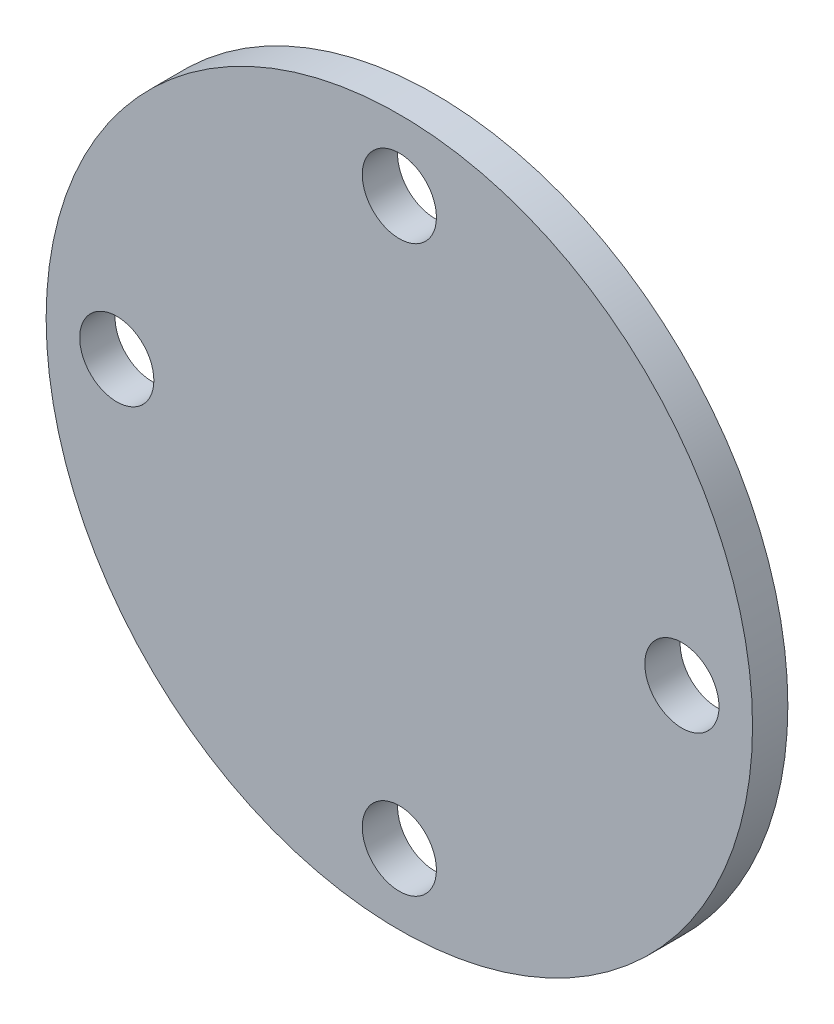
ISO-10303-21;
HEADER;
FILE_DESCRIPTION(('STEP AP214'),'2;1');
FILE_NAME('part.step','',(''),(''),'','','');
FILE_SCHEMA(('AUTOMOTIVE_DESIGN { 1 0 10303 214 1 1 1 1 }'));
ENDSEC;
DATA;
#1=APPLICATION_CONTEXT('core data for automotive mechanical design processes');
#2=APPLICATION_PROTOCOL_DEFINITION('international standard','automotive_design',2000,#1);
#3=PRODUCT_CONTEXT('',#1,'mechanical');
#4=PRODUCT('Part','Part','',(#3));
#5=PRODUCT_RELATED_PRODUCT_CATEGORY('part','',(#4));
#6=PRODUCT_DEFINITION_FORMATION('','',#4);
#7=PRODUCT_DEFINITION_CONTEXT('part definition',#1,'design');
#8=PRODUCT_DEFINITION('design','',#6,#7);
#9=PRODUCT_DEFINITION_SHAPE('','',#8);
#10=(LENGTH_UNIT() NAMED_UNIT(*) SI_UNIT(.MILLI.,.METRE.));
#11=(NAMED_UNIT(*) PLANE_ANGLE_UNIT() SI_UNIT($,.RADIAN.));
#12=(NAMED_UNIT(*) SI_UNIT($,.STERADIAN.) SOLID_ANGLE_UNIT());
#13=UNCERTAINTY_MEASURE_WITH_UNIT(LENGTH_MEASURE(1.E-05),#10,'distance_accuracy_value','');
#14=(GEOMETRIC_REPRESENTATION_CONTEXT(3) GLOBAL_UNCERTAINTY_ASSIGNED_CONTEXT((#13)) GLOBAL_UNIT_ASSIGNED_CONTEXT((#10,
#11,#12)) REPRESENTATION_CONTEXT('',''));
#15=CARTESIAN_POINT('',(0.,0.,0.));
#16=DIRECTION('',(0.,0.,1.));
#17=DIRECTION('',(1.,0.,0.));
#18=AXIS2_PLACEMENT_3D('',#15,#16,#17);
#19=CARTESIAN_POINT('',(0.,0.,1.));
#20=DIRECTION('',(0.,0.,-1.));
#21=DIRECTION('',(-1.,0.,0.));
#22=AXIS2_PLACEMENT_3D('',#19,#20,#21);
#23=CYLINDRICAL_SURFACE('',#22,10.);
#24=CARTESIAN_POINT('',(0.,0.,1.));
#25=DIRECTION('',(0.,0.,1.));
#26=DIRECTION('',(1.,0.,0.));
#27=AXIS2_PLACEMENT_3D('',#24,#25,#26);
#28=CIRCLE('',#27,10.);
#29=CARTESIAN_POINT('',(10.,0.,1.));
#30=VERTEX_POINT('',#29);
#31=EDGE_CURVE('E10',#30,#30,#28,.T.);
#32=ORIENTED_EDGE('',*,*,#31,.F.);
#33=EDGE_LOOP('',(#32));
#34=FACE_BOUND('',#33,.T.);
#35=CARTESIAN_POINT('',(0.,0.,0.));
#36=DIRECTION('',(0.,0.,1.));
#37=DIRECTION('',(1.,0.,0.));
#38=AXIS2_PLACEMENT_3D('',#35,#36,#37);
#39=CIRCLE('',#38,10.);
#40=CARTESIAN_POINT('',(10.,0.,0.));
#41=VERTEX_POINT('',#40);
#42=EDGE_CURVE('E39',#41,#41,#39,.T.);
#43=ORIENTED_EDGE('',*,*,#42,.T.);
#44=EDGE_LOOP('',(#43));
#45=FACE_BOUND('',#44,.T.);
#46=ADVANCED_FACE('F36',(#34,#45),#23,.T.);
#47=CARTESIAN_POINT('',(0.,0.,1.));
#48=DIRECTION('',(0.,0.,1.));
#49=DIRECTION('',(1.,0.,0.));
#50=AXIS2_PLACEMENT_3D('',#47,#48,#49);
#51=PLANE('',#50);
#52=CARTESIAN_POINT('',(0.,8.,1.));
#53=DIRECTION('',(0.,0.,1.));
#54=DIRECTION('',(1.,0.,0.));
#55=AXIS2_PLACEMENT_3D('',#52,#53,#54);
#56=CIRCLE('',#55,1.05);
#57=CARTESIAN_POINT('',(1.05,8.,1.));
#58=VERTEX_POINT('',#57);
#59=EDGE_CURVE('E74',#58,#58,#56,.T.);
#60=ORIENTED_EDGE('',*,*,#59,.F.);
#61=EDGE_LOOP('',(#60));
#62=FACE_BOUND('',#61,.T.);
#63=CARTESIAN_POINT('',(8.00000000000023,2.25904099284255E-13,1.));
#64=DIRECTION('',(0.,0.,1.));
#65=DIRECTION('',(1.,0.,0.));
#66=AXIS2_PLACEMENT_3D('',#63,#64,#65);
#67=CIRCLE('',#66,1.05000000000018);
#68=CARTESIAN_POINT('',(9.0500000000004,2.25904099284255E-13,1.));
#69=VERTEX_POINT('',#68);
#70=EDGE_CURVE('E66',#69,#69,#67,.T.);
#71=ORIENTED_EDGE('',*,*,#70,.F.);
#72=EDGE_LOOP('',(#71));
#73=FACE_BOUND('',#72,.T.);
#74=CARTESIAN_POINT('',(4.51808198568511E-13,-8.,1.));
#75=DIRECTION('',(0.,0.,1.));
#76=DIRECTION('',(1.,0.,0.));
#77=AXIS2_PLACEMENT_3D('',#74,#75,#76);
#78=CIRCLE('',#77,1.05000000000049);
#79=CARTESIAN_POINT('',(1.05000000000094,-8.,1.));
#80=VERTEX_POINT('',#79);
#81=EDGE_CURVE('E58',#80,#80,#78,.T.);
#82=ORIENTED_EDGE('',*,*,#81,.F.);
#83=EDGE_LOOP('',(#82));
#84=FACE_BOUND('',#83,.T.);
#85=CARTESIAN_POINT('',(-7.99999999999977,-2.26883816723573E-13,1.));
#86=DIRECTION('',(0.,0.,1.));
#87=DIRECTION('',(1.,0.,0.));
#88=AXIS2_PLACEMENT_3D('',#85,#86,#87);
#89=CIRCLE('',#88,1.05000000000036);
#90=CARTESIAN_POINT('',(-6.94999999999941,-2.26883816723573E-13,1.));
#91=VERTEX_POINT('',#90);
#92=EDGE_CURVE('E50',#91,#91,#89,.T.);
#93=ORIENTED_EDGE('',*,*,#92,.F.);
#94=EDGE_LOOP('',(#93));
#95=FACE_BOUND('',#94,.T.);
#96=ORIENTED_EDGE('',*,*,#31,.T.);
#97=EDGE_LOOP('',(#96));
#98=FACE_BOUND('',#97,.T.);
#99=ADVANCED_FACE('F92',(#62,#73,#84,#95,#98),#51,.T.);
#100=CARTESIAN_POINT('',(0.,0.,0.));
#101=DIRECTION('',(0.,0.,1.));
#102=DIRECTION('',(1.,0.,0.));
#103=AXIS2_PLACEMENT_3D('',#100,#101,#102);
#104=PLANE('',#103);
#105=CARTESIAN_POINT('',(0.,8.,0.));
#106=DIRECTION('',(0.,0.,1.));
#107=DIRECTION('',(1.,0.,0.));
#108=AXIS2_PLACEMENT_3D('',#105,#106,#107);
#109=CIRCLE('',#108,1.05);
#110=CARTESIAN_POINT('',(1.05,8.,0.));
#111=VERTEX_POINT('',#110);
#112=EDGE_CURVE('E48',#111,#111,#109,.T.);
#113=ORIENTED_EDGE('',*,*,#112,.T.);
#114=EDGE_LOOP('',(#113));
#115=FACE_BOUND('',#114,.T.);
#116=CARTESIAN_POINT('',(8.00000000000023,2.25904099284255E-13,0.));
#117=DIRECTION('',(0.,0.,1.));
#118=DIRECTION('',(1.,0.,0.));
#119=AXIS2_PLACEMENT_3D('',#116,#117,#118);
#120=CIRCLE('',#119,1.05000000000018);
#121=CARTESIAN_POINT('',(9.0500000000004,2.25904099284255E-13,0.));
#122=VERTEX_POINT('',#121);
#123=EDGE_CURVE('E70',#122,#122,#120,.T.);
#124=ORIENTED_EDGE('',*,*,#123,.T.);
#125=EDGE_LOOP('',(#124));
#126=FACE_BOUND('',#125,.T.);
#127=CARTESIAN_POINT('',(4.51808198568511E-13,-8.,0.));
#128=DIRECTION('',(0.,0.,1.));
#129=DIRECTION('',(1.,0.,0.));
#130=AXIS2_PLACEMENT_3D('',#127,#128,#129);
#131=CIRCLE('',#130,1.05000000000049);
#132=CARTESIAN_POINT('',(1.05000000000094,-8.,0.));
#133=VERTEX_POINT('',#132);
#134=EDGE_CURVE('E62',#133,#133,#131,.T.);
#135=ORIENTED_EDGE('',*,*,#134,.T.);
#136=EDGE_LOOP('',(#135));
#137=FACE_BOUND('',#136,.T.);
#138=CARTESIAN_POINT('',(-7.99999999999977,-2.26883816723573E-13,0.));
#139=DIRECTION('',(0.,0.,1.));
#140=DIRECTION('',(1.,0.,0.));
#141=AXIS2_PLACEMENT_3D('',#138,#139,#140);
#142=CIRCLE('',#141,1.05000000000036);
#143=CARTESIAN_POINT('',(-6.94999999999941,-2.26883816723573E-13,0.));
#144=VERTEX_POINT('',#143);
#145=EDGE_CURVE('E54',#144,#144,#142,.T.);
#146=ORIENTED_EDGE('',*,*,#145,.T.);
#147=EDGE_LOOP('',(#146));
#148=FACE_BOUND('',#147,.T.);
#149=ORIENTED_EDGE('',*,*,#42,.F.);
#150=EDGE_LOOP('',(#149));
#151=FACE_BOUND('',#150,.T.);
#152=ADVANCED_FACE('F82',(#115,#126,#137,#148,#151),#104,.F.);
#153=CARTESIAN_POINT('',(-7.99999999999977,-2.26883816723573E-13,0.));
#154=DIRECTION('',(0.,0.,1.));
#155=DIRECTION('',(1.,0.,0.));
#156=AXIS2_PLACEMENT_3D('',#153,#154,#155);
#157=CYLINDRICAL_SURFACE('',#156,1.05000000000036);
#158=ORIENTED_EDGE('',*,*,#145,.F.);
#159=EDGE_LOOP('',(#158));
#160=FACE_BOUND('',#159,.T.);
#161=ORIENTED_EDGE('',*,*,#92,.T.);
#162=EDGE_LOOP('',(#161));
#163=FACE_BOUND('',#162,.T.);
#164=ADVANCED_FACE('F102',(#160,#163),#157,.F.);
#165=CARTESIAN_POINT('',(4.51808198568511E-13,-8.,0.));
#166=DIRECTION('',(0.,0.,1.));
#167=DIRECTION('',(1.,0.,0.));
#168=AXIS2_PLACEMENT_3D('',#165,#166,#167);
#169=CYLINDRICAL_SURFACE('',#168,1.05000000000049);
#170=ORIENTED_EDGE('',*,*,#134,.F.);
#171=EDGE_LOOP('',(#170));
#172=FACE_BOUND('',#171,.T.);
#173=ORIENTED_EDGE('',*,*,#81,.T.);
#174=EDGE_LOOP('',(#173));
#175=FACE_BOUND('',#174,.T.);
#176=ADVANCED_FACE('F104',(#172,#175),#169,.F.);
#177=CARTESIAN_POINT('',(8.00000000000023,2.25904099284255E-13,0.));
#178=DIRECTION('',(0.,0.,1.));
#179=DIRECTION('',(1.,0.,0.));
#180=AXIS2_PLACEMENT_3D('',#177,#178,#179);
#181=CYLINDRICAL_SURFACE('',#180,1.05000000000018);
#182=ORIENTED_EDGE('',*,*,#123,.F.);
#183=EDGE_LOOP('',(#182));
#184=FACE_BOUND('',#183,.T.);
#185=ORIENTED_EDGE('',*,*,#70,.T.);
#186=EDGE_LOOP('',(#185));
#187=FACE_BOUND('',#186,.T.);
#188=ADVANCED_FACE('F88',(#184,#187),#181,.F.);
#189=CARTESIAN_POINT('',(0.,8.,0.));
#190=DIRECTION('',(0.,0.,1.));
#191=DIRECTION('',(1.,0.,0.));
#192=AXIS2_PLACEMENT_3D('',#189,#190,#191);
#193=CYLINDRICAL_SURFACE('',#192,1.05);
#194=ORIENTED_EDGE('',*,*,#112,.F.);
#195=EDGE_LOOP('',(#194));
#196=FACE_BOUND('',#195,.T.);
#197=ORIENTED_EDGE('',*,*,#59,.T.);
#198=EDGE_LOOP('',(#197));
#199=FACE_BOUND('',#198,.T.);
#200=ADVANCED_FACE('F85',(#196,#199),#193,.F.);
#201=CLOSED_SHELL('',(#46,#99,#152,#164,#176,#188,#200));
#202=MANIFOLD_SOLID_BREP('B2',#201);
#203=ADVANCED_BREP_SHAPE_REPRESENTATION('',(#18,#202),#14);
#204=SHAPE_DEFINITION_REPRESENTATION(#9,#203);
ENDSEC;
END-ISO-10303-21;
